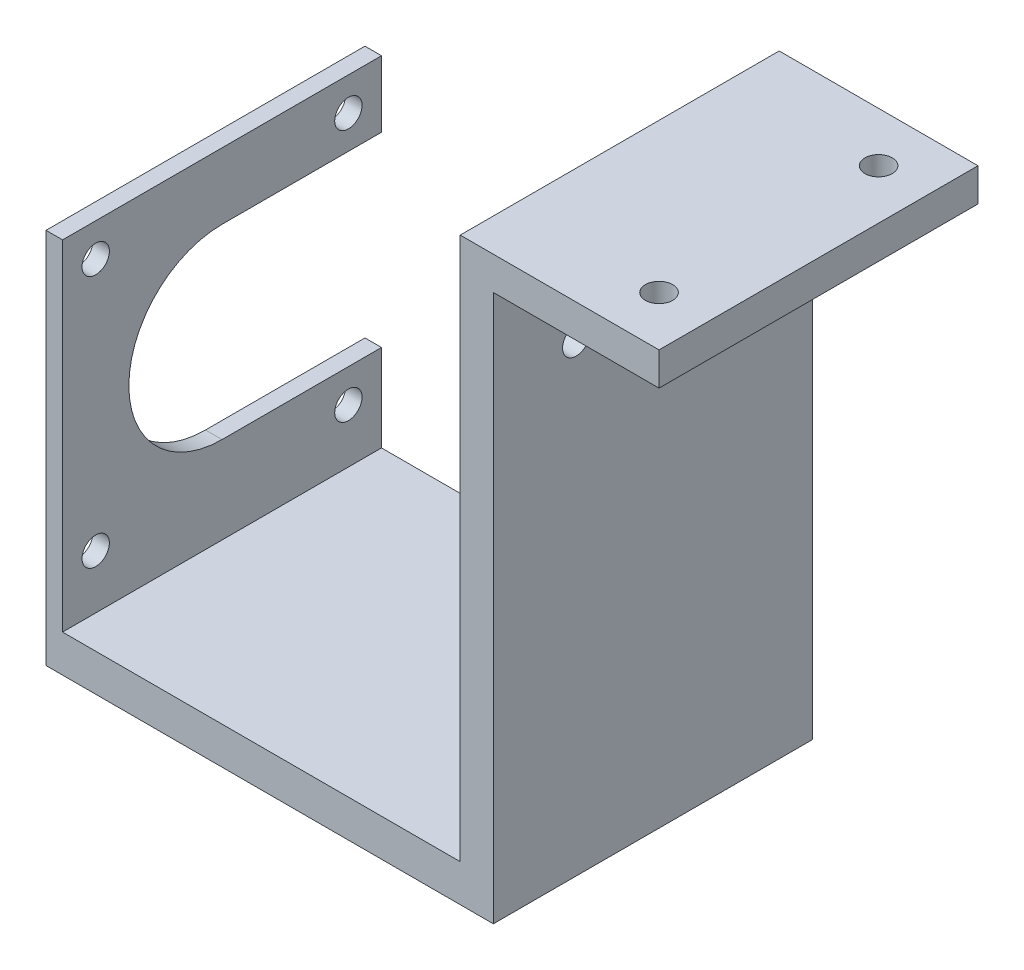
ISO-10303-21;
HEADER;
FILE_DESCRIPTION(('STEP AP214'),'2;1');
FILE_NAME('part.step','',(''),(''),'','','');
FILE_SCHEMA(('AUTOMOTIVE_DESIGN { 1 0 10303 214 1 1 1 1 }'));
ENDSEC;
DATA;
#1=APPLICATION_CONTEXT('core data for automotive mechanical design processes');
#2=APPLICATION_PROTOCOL_DEFINITION('international standard','automotive_design',2000,#1);
#3=PRODUCT_CONTEXT('',#1,'mechanical');
#4=PRODUCT('Part','Part','',(#3));
#5=PRODUCT_RELATED_PRODUCT_CATEGORY('part','',(#4));
#6=PRODUCT_DEFINITION_FORMATION('','',#4);
#7=PRODUCT_DEFINITION_CONTEXT('part definition',#1,'design');
#8=PRODUCT_DEFINITION('design','',#6,#7);
#9=PRODUCT_DEFINITION_SHAPE('','',#8);
#10=(LENGTH_UNIT() NAMED_UNIT(*) SI_UNIT(.MILLI.,.METRE.));
#11=(NAMED_UNIT(*) PLANE_ANGLE_UNIT() SI_UNIT($,.RADIAN.));
#12=(NAMED_UNIT(*) SI_UNIT($,.STERADIAN.) SOLID_ANGLE_UNIT());
#13=UNCERTAINTY_MEASURE_WITH_UNIT(LENGTH_MEASURE(1.E-05),#10,'distance_accuracy_value','');
#14=(GEOMETRIC_REPRESENTATION_CONTEXT(3) GLOBAL_UNCERTAINTY_ASSIGNED_CONTEXT((#13)) GLOBAL_UNIT_ASSIGNED_CONTEXT((#10,
#11,#12)) REPRESENTATION_CONTEXT('',''));
#15=CARTESIAN_POINT('',(0.,0.,0.));
#16=DIRECTION('',(0.,0.,1.));
#17=DIRECTION('',(1.,0.,0.));
#18=AXIS2_PLACEMENT_3D('',#15,#16,#17);
#19=CARTESIAN_POINT('',(24.,-16.,-25.75));
#20=DIRECTION('',(0.,0.,-1.));
#21=DIRECTION('',(-1.,0.,0.));
#22=AXIS2_PLACEMENT_3D('',#19,#20,#21);
#23=PLANE('',#22);
#24=DIRECTION('',(1.,0.,0.));
#25=VECTOR('',#24,1.);
#26=CARTESIAN_POINT('',(28.,-15.5,-25.75));
#27=LINE('',#26,#25);
#28=CARTESIAN_POINT('',(28.,-15.5,-25.75));
#29=VERTEX_POINT('',#28);
#30=CARTESIAN_POINT('',(76.,-15.5,-25.75));
#31=VERTEX_POINT('',#30);
#32=EDGE_CURVE('E172',#29,#31,#27,.T.);
#33=ORIENTED_EDGE('',*,*,#32,.T.);
#34=DIRECTION('',(0.,-1.,0.));
#35=VECTOR('',#34,1.);
#36=CARTESIAN_POINT('',(76.,49.5,-25.75));
#37=LINE('',#36,#35);
#38=CARTESIAN_POINT('',(76.,50.,-25.75));
#39=VERTEX_POINT('',#38);
#40=EDGE_CURVE('E197',#39,#31,#37,.T.);
#41=ORIENTED_EDGE('',*,*,#40,.F.);
#42=DIRECTION('',(1.,0.,0.));
#43=VECTOR('',#42,1.);
#44=CARTESIAN_POINT('',(76.,50.,-25.75));
#45=LINE('',#44,#43);
#46=CARTESIAN_POINT('',(100.,50.,-25.75));
#47=VERTEX_POINT('',#46);
#48=EDGE_CURVE('E220',#39,#47,#45,.T.);
#49=ORIENTED_EDGE('',*,*,#48,.T.);
#50=DIRECTION('',(0.,1.,0.));
#51=VECTOR('',#50,1.);
#52=CARTESIAN_POINT('',(100.,49.5,-25.75));
#53=LINE('',#52,#51);
#54=CARTESIAN_POINT('',(100.,46.0023371221997,-25.75));
#55=VERTEX_POINT('',#54);
#56=EDGE_CURVE('E211',#55,#47,#53,.T.);
#57=ORIENTED_EDGE('',*,*,#56,.F.);
#58=DIRECTION('',(1.,0.,0.));
#59=VECTOR('',#58,1.);
#60=CARTESIAN_POINT('',(80.,46.0023371221997,-25.75));
#61=LINE('',#60,#59);
#62=CARTESIAN_POINT('',(80.,46.0023371221997,-25.75));
#63=VERTEX_POINT('',#62);
#64=EDGE_CURVE('E230',#63,#55,#61,.T.);
#65=ORIENTED_EDGE('',*,*,#64,.F.);
#66=DIRECTION('',(0.,-1.,0.));
#67=VECTOR('',#66,1.);
#68=CARTESIAN_POINT('',(80.,49.5,-25.75));
#69=LINE('',#68,#67);
#70=CARTESIAN_POINT('',(80.,-20.,-25.75));
#71=VERTEX_POINT('',#70);
#72=EDGE_CURVE('E199',#63,#71,#69,.T.);
#73=ORIENTED_EDGE('',*,*,#72,.T.);
#74=DIRECTION('',(1.,0.,0.));
#75=VECTOR('',#74,1.);
#76=CARTESIAN_POINT('',(0.,-20.,-25.75));
#77=LINE('',#76,#75);
#78=CARTESIAN_POINT('',(26.,-20.,-25.75));
#79=VERTEX_POINT('',#78);
#80=EDGE_CURVE('E169',#79,#71,#77,.T.);
#81=ORIENTED_EDGE('',*,*,#80,.F.);
#82=DIRECTION('',(0.,-1.,0.));
#83=VECTOR('',#82,1.);
#84=CARTESIAN_POINT('',(26.,40.,-25.75));
#85=LINE('',#84,#83);
#86=CARTESIAN_POINT('',(26.,-5.,-25.75));
#87=VERTEX_POINT('',#86);
#88=EDGE_CURVE('E263',#87,#79,#85,.T.);
#89=ORIENTED_EDGE('',*,*,#88,.F.);
#90=DIRECTION('',(-1.,0.,0.));
#91=VECTOR('',#90,1.);
#92=CARTESIAN_POINT('',(28.,-5.,-25.75));
#93=LINE('',#92,#91);
#94=CARTESIAN_POINT('',(28.,-5.,-25.75));
#95=VERTEX_POINT('',#94);
#96=EDGE_CURVE('E143',#95,#87,#93,.T.);
#97=ORIENTED_EDGE('',*,*,#96,.F.);
#98=DIRECTION('',(0.,1.,0.));
#99=VECTOR('',#98,1.);
#100=CARTESIAN_POINT('',(28.,-16.,-25.75));
#101=LINE('',#100,#99);
#102=EDGE_CURVE('E11',#29,#95,#101,.T.);
#103=ORIENTED_EDGE('',*,*,#102,.F.);
#104=EDGE_LOOP('',(#33,#41,#49,#57,#65,#73,#81,#89,#97,#103));
#105=FACE_BOUND('',#104,.T.);
#106=ADVANCED_FACE('F35',(#105),#23,.T.);
#107=CARTESIAN_POINT('',(28.,22.5,-21.75));
#108=DIRECTION('',(-1.,0.,0.));
#109=DIRECTION('',(0.,0.,1.));
#110=AXIS2_PLACEMENT_3D('',#107,#108,#109);
#111=PLANE('',#110);
#112=CARTESIAN_POINT('',(28.,21.5,8.75));
#113=DIRECTION('',(1.,0.,0.));
#114=DIRECTION('',(0.,0.,-1.));
#115=AXIS2_PLACEMENT_3D('',#112,#113,#114);
#116=CIRCLE('',#115,1.65);
#117=CARTESIAN_POINT('',(28.,21.5,7.1));
#118=VERTEX_POINT('',#117);
#119=EDGE_CURVE('E181',#118,#118,#116,.T.);
#120=ORIENTED_EDGE('',*,*,#119,.F.);
#121=EDGE_LOOP('',(#120));
#122=FACE_BOUND('',#121,.T.);
#123=CARTESIAN_POINT('',(28.,21.5,-21.75));
#124=DIRECTION('',(1.,0.,0.));
#125=DIRECTION('',(0.,0.,-1.));
#126=AXIS2_PLACEMENT_3D('',#123,#124,#125);
#127=CIRCLE('',#126,1.65);
#128=CARTESIAN_POINT('',(28.,21.5,-23.4));
#129=VERTEX_POINT('',#128);
#130=EDGE_CURVE('E184',#129,#129,#127,.T.);
#131=ORIENTED_EDGE('',*,*,#130,.F.);
#132=EDGE_LOOP('',(#131));
#133=FACE_BOUND('',#132,.T.);
#134=CARTESIAN_POINT('',(28.,-9.,-21.75));
#135=DIRECTION('',(-1.,0.,0.));
#136=DIRECTION('',(0.,0.,1.));
#137=AXIS2_PLACEMENT_3D('',#134,#135,#136);
#138=CIRCLE('',#137,1.65);
#139=CARTESIAN_POINT('',(28.,-9.,-20.1));
#140=VERTEX_POINT('',#139);
#141=EDGE_CURVE('E187',#140,#140,#138,.T.);
#142=ORIENTED_EDGE('',*,*,#141,.T.);
#143=EDGE_LOOP('',(#142));
#144=FACE_BOUND('',#143,.T.);
#145=CARTESIAN_POINT('',(28.,-9.,8.75));
#146=DIRECTION('',(-1.,0.,0.));
#147=DIRECTION('',(0.,0.,1.));
#148=AXIS2_PLACEMENT_3D('',#145,#146,#147);
#149=CIRCLE('',#148,1.65);
#150=CARTESIAN_POINT('',(28.,-9.,10.4));
#151=VERTEX_POINT('',#150);
#152=EDGE_CURVE('E190',#151,#151,#149,.T.);
#153=ORIENTED_EDGE('',*,*,#152,.T.);
#154=EDGE_LOOP('',(#153));
#155=FACE_BOUND('',#154,.T.);
#156=DIRECTION('',(0.,0.,-1.));
#157=VECTOR('',#156,1.);
#158=CARTESIAN_POINT('',(28.,-5.,0.));
#159=LINE('',#158,#157);
#160=CARTESIAN_POINT('',(28.,-5.,-6.5));
#161=VERTEX_POINT('',#160);
#162=EDGE_CURVE('E154',#161,#95,#159,.T.);
#163=ORIENTED_EDGE('',*,*,#162,.F.);
#164=CARTESIAN_POINT('',(28.,6.25,-6.5));
#165=DIRECTION('',(-1.,0.,0.));
#166=DIRECTION('',(0.,0.,1.));
#167=AXIS2_PLACEMENT_3D('',#164,#165,#166);
#168=CIRCLE('',#167,11.25);
#169=CARTESIAN_POINT('',(28.,17.5,-6.5));
#170=VERTEX_POINT('',#169);
#171=EDGE_CURVE('E153',#161,#170,#168,.T.);
#172=ORIENTED_EDGE('',*,*,#171,.T.);
#173=DIRECTION('',(0.,0.,-1.));
#174=VECTOR('',#173,1.);
#175=CARTESIAN_POINT('',(28.,17.5,0.));
#176=LINE('',#175,#174);
#177=CARTESIAN_POINT('',(28.,17.5,-25.75));
#178=VERTEX_POINT('',#177);
#179=EDGE_CURVE('E59',#170,#178,#176,.T.);
#180=ORIENTED_EDGE('',*,*,#179,.T.);
#181=CARTESIAN_POINT('',(28.,25.5,-25.75));
#182=VERTEX_POINT('',#181);
#183=EDGE_CURVE('E44',#178,#182,#101,.T.);
#184=ORIENTED_EDGE('',*,*,#183,.T.);
#185=DIRECTION('',(0.,0.,-1.));
#186=VECTOR('',#185,1.);
#187=CARTESIAN_POINT('',(28.,25.5,-25.75));
#188=LINE('',#187,#186);
#189=CARTESIAN_POINT('',(28.,25.5,12.75));
#190=VERTEX_POINT('',#189);
#191=EDGE_CURVE('E167',#190,#182,#188,.T.);
#192=ORIENTED_EDGE('',*,*,#191,.F.);
#193=DIRECTION('',(0.,1.,0.));
#194=VECTOR('',#193,1.);
#195=CARTESIAN_POINT('',(28.,-16.,12.75));
#196=LINE('',#195,#194);
#197=CARTESIAN_POINT('',(28.,-15.5,12.75));
#198=VERTEX_POINT('',#197);
#199=EDGE_CURVE('E160',#198,#190,#196,.T.);
#200=ORIENTED_EDGE('',*,*,#199,.F.);
#201=DIRECTION('',(0.,0.,-1.));
#202=VECTOR('',#201,1.);
#203=CARTESIAN_POINT('',(28.,-15.5,12.75));
#204=LINE('',#203,#202);
#205=EDGE_CURVE('E177',#198,#29,#204,.T.);
#206=ORIENTED_EDGE('',*,*,#205,.T.);
#207=ORIENTED_EDGE('',*,*,#102,.T.);
#208=EDGE_LOOP('',(#163,#172,#180,#184,#192,#200,#206,#207));
#209=FACE_BOUND('',#208,.T.);
#210=ADVANCED_FACE('F149',(#122,#133,#144,#155,#209),#111,.F.);
#211=CARTESIAN_POINT('',(26.,40.,12.75));
#212=DIRECTION('',(1.,0.,0.));
#213=DIRECTION('',(0.,0.,-1.));
#214=AXIS2_PLACEMENT_3D('',#211,#212,#213);
#215=PLANE('',#214);
#216=CARTESIAN_POINT('',(26.,21.5,8.75));
#217=DIRECTION('',(1.,0.,0.));
#218=DIRECTION('',(0.,0.,-1.));
#219=AXIS2_PLACEMENT_3D('',#216,#217,#218);
#220=CIRCLE('',#219,1.65);
#221=CARTESIAN_POINT('',(26.,21.5,7.1));
#222=VERTEX_POINT('',#221);
#223=EDGE_CURVE('E251',#222,#222,#220,.F.);
#224=ORIENTED_EDGE('',*,*,#223,.F.);
#225=EDGE_LOOP('',(#224));
#226=FACE_BOUND('',#225,.T.);
#227=CARTESIAN_POINT('',(26.,-9.,-21.75));
#228=DIRECTION('',(1.,0.,0.));
#229=DIRECTION('',(0.,0.,-1.));
#230=AXIS2_PLACEMENT_3D('',#227,#228,#229);
#231=CIRCLE('',#230,1.65);
#232=CARTESIAN_POINT('',(26.,-9.,-23.4));
#233=VERTEX_POINT('',#232);
#234=EDGE_CURVE('E257',#233,#233,#231,.F.);
#235=ORIENTED_EDGE('',*,*,#234,.F.);
#236=EDGE_LOOP('',(#235));
#237=FACE_BOUND('',#236,.T.);
#238=CARTESIAN_POINT('',(26.,-9.,8.75));
#239=DIRECTION('',(1.,0.,0.));
#240=DIRECTION('',(0.,0.,-1.));
#241=AXIS2_PLACEMENT_3D('',#238,#239,#240);
#242=CIRCLE('',#241,1.65);
#243=CARTESIAN_POINT('',(26.,-9.,7.1));
#244=VERTEX_POINT('',#243);
#245=EDGE_CURVE('E39',#244,#244,#242,.F.);
#246=ORIENTED_EDGE('',*,*,#245,.F.);
#247=EDGE_LOOP('',(#246));
#248=FACE_BOUND('',#247,.T.);
#249=CARTESIAN_POINT('',(26.,21.5,-21.75));
#250=DIRECTION('',(1.,0.,0.));
#251=DIRECTION('',(0.,0.,-1.));
#252=AXIS2_PLACEMENT_3D('',#249,#250,#251);
#253=CIRCLE('',#252,1.65);
#254=CARTESIAN_POINT('',(26.,21.5,-23.4));
#255=VERTEX_POINT('',#254);
#256=EDGE_CURVE('E254',#255,#255,#253,.F.);
#257=ORIENTED_EDGE('',*,*,#256,.F.);
#258=EDGE_LOOP('',(#257));
#259=FACE_BOUND('',#258,.T.);
#260=DIRECTION('',(0.,0.,-1.));
#261=VECTOR('',#260,1.);
#262=CARTESIAN_POINT('',(26.,-5.,0.));
#263=LINE('',#262,#261);
#264=CARTESIAN_POINT('',(26.,-5.,-6.5));
#265=VERTEX_POINT('',#264);
#266=EDGE_CURVE('E51',#265,#87,#263,.T.);
#267=ORIENTED_EDGE('',*,*,#266,.T.);
#268=ORIENTED_EDGE('',*,*,#88,.T.);
#269=DIRECTION('',(0.,0.,1.));
#270=VECTOR('',#269,1.);
#271=CARTESIAN_POINT('',(26.,-20.,12.75));
#272=LINE('',#271,#270);
#273=CARTESIAN_POINT('',(26.,-20.,12.75));
#274=VERTEX_POINT('',#273);
#275=EDGE_CURVE('E266',#79,#274,#272,.T.);
#276=ORIENTED_EDGE('',*,*,#275,.T.);
#277=DIRECTION('',(0.,-1.,0.));
#278=VECTOR('',#277,1.);
#279=CARTESIAN_POINT('',(26.,40.,12.75));
#280=LINE('',#279,#278);
#281=CARTESIAN_POINT('',(26.,25.5,12.75));
#282=VERTEX_POINT('',#281);
#283=EDGE_CURVE('E262',#282,#274,#280,.T.);
#284=ORIENTED_EDGE('',*,*,#283,.F.);
#285=DIRECTION('',(0.,0.,1.));
#286=VECTOR('',#285,1.);
#287=CARTESIAN_POINT('',(26.,25.5,0.));
#288=LINE('',#287,#286);
#289=CARTESIAN_POINT('',(26.,25.5,-25.75));
#290=VERTEX_POINT('',#289);
#291=EDGE_CURVE('E248',#290,#282,#288,.T.);
#292=ORIENTED_EDGE('',*,*,#291,.F.);
#293=CARTESIAN_POINT('',(26.,17.5,-25.75));
#294=VERTEX_POINT('',#293);
#295=EDGE_CURVE('E260',#290,#294,#85,.T.);
#296=ORIENTED_EDGE('',*,*,#295,.T.);
#297=DIRECTION('',(0.,0.,-1.));
#298=VECTOR('',#297,1.);
#299=CARTESIAN_POINT('',(26.,17.5,0.));
#300=LINE('',#299,#298);
#301=CARTESIAN_POINT('',(26.,17.5,-6.5));
#302=VERTEX_POINT('',#301);
#303=EDGE_CURVE('E138',#302,#294,#300,.T.);
#304=ORIENTED_EDGE('',*,*,#303,.F.);
#305=CARTESIAN_POINT('',(26.,6.25,-6.5));
#306=DIRECTION('',(-1.,0.,0.));
#307=DIRECTION('',(0.,0.,1.));
#308=AXIS2_PLACEMENT_3D('',#305,#306,#307);
#309=CIRCLE('',#308,11.25);
#310=EDGE_CURVE('E268',#265,#302,#309,.T.);
#311=ORIENTED_EDGE('',*,*,#310,.F.);
#312=EDGE_LOOP('',(#267,#268,#276,#284,#292,#296,#304,#311));
#313=FACE_BOUND('',#312,.T.);
#314=ADVANCED_FACE('F323',(#226,#237,#248,#259,#313),#215,.F.);
#315=CARTESIAN_POINT('',(28.,6.25,-6.5));
#316=DIRECTION('',(-1.,0.,0.));
#317=DIRECTION('',(0.,0.,1.));
#318=AXIS2_PLACEMENT_3D('',#315,#316,#317);
#319=CYLINDRICAL_SURFACE('',#318,11.25);
#320=DIRECTION('',(-1.,0.,0.));
#321=VECTOR('',#320,1.);
#322=CARTESIAN_POINT('',(28.,-5.,-6.5));
#323=LINE('',#322,#321);
#324=EDGE_CURVE('E271',#161,#265,#323,.T.);
#325=ORIENTED_EDGE('',*,*,#324,.T.);
#326=ORIENTED_EDGE('',*,*,#310,.T.);
#327=DIRECTION('',(-1.,0.,0.));
#328=VECTOR('',#327,1.);
#329=CARTESIAN_POINT('',(28.,17.5,-6.5));
#330=LINE('',#329,#328);
#331=EDGE_CURVE('E144',#170,#302,#330,.T.);
#332=ORIENTED_EDGE('',*,*,#331,.F.);
#333=ORIENTED_EDGE('',*,*,#171,.F.);
#334=EDGE_LOOP('',(#325,#326,#332,#333));
#335=FACE_BOUND('',#334,.T.);
#336=ADVANCED_FACE('F365',(#335),#319,.F.);
#337=CARTESIAN_POINT('',(80.,49.5,12.75));
#338=DIRECTION('',(1.,0.,0.));
#339=DIRECTION('',(0.,0.,-1.));
#340=AXIS2_PLACEMENT_3D('',#337,#338,#339);
#341=PLANE('',#340);
#342=CARTESIAN_POINT('',(80.,36.,-15.75));
#343=DIRECTION('',(1.,0.,0.));
#344=DIRECTION('',(0.,0.,-1.));
#345=AXIS2_PLACEMENT_3D('',#342,#343,#344);
#346=CIRCLE('',#345,1.65);
#347=CARTESIAN_POINT('',(80.,36.,-17.4));
#348=VERTEX_POINT('',#347);
#349=EDGE_CURVE('E285',#348,#348,#346,.T.);
#350=ORIENTED_EDGE('',*,*,#349,.F.);
#351=EDGE_LOOP('',(#350));
#352=FACE_BOUND('',#351,.T.);
#353=CARTESIAN_POINT('',(80.,36.,2.74999999999999));
#354=DIRECTION('',(1.,0.,0.));
#355=DIRECTION('',(0.,0.,-1.));
#356=AXIS2_PLACEMENT_3D('',#353,#354,#355);
#357=CIRCLE('',#356,1.65);
#358=CARTESIAN_POINT('',(80.,36.,1.09999999999999));
#359=VERTEX_POINT('',#358);
#360=EDGE_CURVE('E278',#359,#359,#357,.T.);
#361=ORIENTED_EDGE('',*,*,#360,.F.);
#362=EDGE_LOOP('',(#361));
#363=FACE_BOUND('',#362,.T.);
#364=ORIENTED_EDGE('',*,*,#72,.F.);
#365=DIRECTION('',(0.,0.,-1.));
#366=VECTOR('',#365,1.);
#367=CARTESIAN_POINT('',(80.,46.0023371221997,-25.75));
#368=LINE('',#367,#366);
#369=CARTESIAN_POINT('',(80.,46.0023371221997,12.75));
#370=VERTEX_POINT('',#369);
#371=EDGE_CURVE('E233',#370,#63,#368,.T.);
#372=ORIENTED_EDGE('',*,*,#371,.F.);
#373=DIRECTION('',(0.,-1.,0.));
#374=VECTOR('',#373,1.);
#375=CARTESIAN_POINT('',(80.,49.5,12.75));
#376=LINE('',#375,#374);
#377=CARTESIAN_POINT('',(80.,-20.,12.75));
#378=VERTEX_POINT('',#377);
#379=EDGE_CURVE('E203',#370,#378,#376,.T.);
#380=ORIENTED_EDGE('',*,*,#379,.T.);
#381=DIRECTION('',(0.,0.,1.));
#382=VECTOR('',#381,1.);
#383=CARTESIAN_POINT('',(80.,-20.,12.75));
#384=LINE('',#383,#382);
#385=EDGE_CURVE('E200',#71,#378,#384,.T.);
#386=ORIENTED_EDGE('',*,*,#385,.F.);
#387=EDGE_LOOP('',(#364,#372,#380,#386));
#388=FACE_BOUND('',#387,.T.);
#389=ADVANCED_FACE('F298',(#352,#363,#388),#341,.T.);
#390=CARTESIAN_POINT('',(76.,49.5,12.75));
#391=DIRECTION('',(-1.,0.,0.));
#392=DIRECTION('',(0.,0.,1.));
#393=AXIS2_PLACEMENT_3D('',#390,#391,#392);
#394=PLANE('',#393);
#395=DIRECTION('',(0.,0.,1.));
#396=VECTOR('',#395,1.);
#397=CARTESIAN_POINT('',(76.,-15.5,12.75));
#398=LINE('',#397,#396);
#399=CARTESIAN_POINT('',(76.,-15.5,12.75));
#400=VERTEX_POINT('',#399);
#401=EDGE_CURVE('E193',#31,#400,#398,.T.);
#402=ORIENTED_EDGE('',*,*,#401,.T.);
#403=DIRECTION('',(0.,-1.,0.));
#404=VECTOR('',#403,1.);
#405=CARTESIAN_POINT('',(76.,49.5,12.75));
#406=LINE('',#405,#404);
#407=CARTESIAN_POINT('',(76.,50.,12.75));
#408=VERTEX_POINT('',#407);
#409=EDGE_CURVE('E196',#408,#400,#406,.T.);
#410=ORIENTED_EDGE('',*,*,#409,.F.);
#411=DIRECTION('',(0.,0.,-1.));
#412=VECTOR('',#411,1.);
#413=CARTESIAN_POINT('',(76.,50.,12.75));
#414=LINE('',#413,#412);
#415=EDGE_CURVE('E214',#408,#39,#414,.T.);
#416=ORIENTED_EDGE('',*,*,#415,.T.);
#417=ORIENTED_EDGE('',*,*,#40,.T.);
#418=EDGE_LOOP('',(#402,#410,#416,#417));
#419=FACE_BOUND('',#418,.T.);
#420=CARTESIAN_POINT('',(76.,36.,-15.75));
#421=DIRECTION('',(-1.,0.,0.));
#422=DIRECTION('',(0.,0.,1.));
#423=AXIS2_PLACEMENT_3D('',#420,#421,#422);
#424=CIRCLE('',#423,1.65);
#425=CARTESIAN_POINT('',(76.,36.,-14.1));
#426=VERTEX_POINT('',#425);
#427=EDGE_CURVE('E288',#426,#426,#424,.T.);
#428=ORIENTED_EDGE('',*,*,#427,.F.);
#429=EDGE_LOOP('',(#428));
#430=FACE_BOUND('',#429,.T.);
#431=CARTESIAN_POINT('',(76.,36.,2.74999999999999));
#432=DIRECTION('',(-1.,0.,0.));
#433=DIRECTION('',(0.,0.,1.));
#434=AXIS2_PLACEMENT_3D('',#431,#432,#433);
#435=CIRCLE('',#434,1.65);
#436=CARTESIAN_POINT('',(76.,36.,4.39999999999999));
#437=VERTEX_POINT('',#436);
#438=EDGE_CURVE('E282',#437,#437,#435,.T.);
#439=ORIENTED_EDGE('',*,*,#438,.F.);
#440=EDGE_LOOP('',(#439));
#441=FACE_BOUND('',#440,.T.);
#442=ADVANCED_FACE('F294',(#419,#430,#441),#394,.T.);
#443=CARTESIAN_POINT('',(24.,-16.,12.75));
#444=DIRECTION('',(0.,0.,1.));
#445=DIRECTION('',(1.,0.,0.));
#446=AXIS2_PLACEMENT_3D('',#443,#444,#445);
#447=PLANE('',#446);
#448=ORIENTED_EDGE('',*,*,#409,.T.);
#449=DIRECTION('',(1.,0.,0.));
#450=VECTOR('',#449,1.);
#451=CARTESIAN_POINT('',(28.,-15.5,12.75));
#452=LINE('',#451,#450);
#453=EDGE_CURVE('E174',#198,#400,#452,.T.);
#454=ORIENTED_EDGE('',*,*,#453,.F.);
#455=ORIENTED_EDGE('',*,*,#199,.T.);
#456=DIRECTION('',(1.,0.,0.));
#457=VECTOR('',#456,1.);
#458=CARTESIAN_POINT('',(28.,25.5,12.75));
#459=LINE('',#458,#457);
#460=EDGE_CURVE('E162',#282,#190,#459,.T.);
#461=ORIENTED_EDGE('',*,*,#460,.F.);
#462=ORIENTED_EDGE('',*,*,#283,.T.);
#463=DIRECTION('',(1.,0.,0.));
#464=VECTOR('',#463,1.);
#465=CARTESIAN_POINT('',(0.,-20.,12.75));
#466=LINE('',#465,#464);
#467=EDGE_CURVE('E170',#274,#378,#466,.T.);
#468=ORIENTED_EDGE('',*,*,#467,.T.);
#469=ORIENTED_EDGE('',*,*,#379,.F.);
#470=DIRECTION('',(-1.,0.,0.));
#471=VECTOR('',#470,1.);
#472=CARTESIAN_POINT('',(80.,46.0023371221997,12.75));
#473=LINE('',#472,#471);
#474=CARTESIAN_POINT('',(100.,46.0023371221997,12.75));
#475=VERTEX_POINT('',#474);
#476=EDGE_CURVE('E223',#475,#370,#473,.T.);
#477=ORIENTED_EDGE('',*,*,#476,.F.);
#478=DIRECTION('',(0.,-1.,0.));
#479=VECTOR('',#478,1.);
#480=CARTESIAN_POINT('',(100.,49.5,12.75));
#481=LINE('',#480,#479);
#482=CARTESIAN_POINT('',(100.,50.,12.75));
#483=VERTEX_POINT('',#482);
#484=EDGE_CURVE('E209',#483,#475,#481,.T.);
#485=ORIENTED_EDGE('',*,*,#484,.F.);
#486=DIRECTION('',(1.,0.,0.));
#487=VECTOR('',#486,1.);
#488=CARTESIAN_POINT('',(76.,50.,12.75));
#489=LINE('',#488,#487);
#490=EDGE_CURVE('E217',#408,#483,#489,.T.);
#491=ORIENTED_EDGE('',*,*,#490,.F.);
#492=EDGE_LOOP('',(#448,#454,#455,#461,#462,#468,#469,#477,#485,#491));
#493=FACE_BOUND('',#492,.T.);
#494=ADVANCED_FACE('F297',(#493),#447,.T.);
#495=DIRECTION('',(-1.,0.,0.));
#496=VECTOR('',#495,1.);
#497=CARTESIAN_POINT('',(28.,17.5,-25.75));
#498=LINE('',#497,#496);
#499=EDGE_CURVE('E135',#178,#294,#498,.T.);
#500=ORIENTED_EDGE('',*,*,#499,.T.);
#501=ORIENTED_EDGE('',*,*,#295,.F.);
#502=DIRECTION('',(-1.,0.,0.));
#503=VECTOR('',#502,1.);
#504=CARTESIAN_POINT('',(28.,25.5,-25.75));
#505=LINE('',#504,#503);
#506=EDGE_CURVE('E159',#182,#290,#505,.T.);
#507=ORIENTED_EDGE('',*,*,#506,.F.);
#508=ORIENTED_EDGE('',*,*,#183,.F.);
#509=EDGE_LOOP('',(#500,#501,#507,#508));
#510=FACE_BOUND('',#509,.T.);
#511=ADVANCED_FACE('F157',(#510),#23,.T.);
#512=CARTESIAN_POINT('',(0.,-20.,0.));
#513=DIRECTION('',(0.,1.,0.));
#514=DIRECTION('',(0.,0.,1.));
#515=AXIS2_PLACEMENT_3D('',#512,#513,#514);
#516=PLANE('',#515);
#517=ORIENTED_EDGE('',*,*,#467,.F.);
#518=ORIENTED_EDGE('',*,*,#275,.F.);
#519=ORIENTED_EDGE('',*,*,#80,.T.);
#520=ORIENTED_EDGE('',*,*,#385,.T.);
#521=EDGE_LOOP('',(#517,#518,#519,#520));
#522=FACE_BOUND('',#521,.T.);
#523=ADVANCED_FACE('F37',(#522),#516,.F.);
#524=CARTESIAN_POINT('',(0.,25.5,0.));
#525=DIRECTION('',(0.,-1.,0.));
#526=DIRECTION('',(0.,0.,-1.));
#527=AXIS2_PLACEMENT_3D('',#524,#525,#526);
#528=PLANE('',#527);
#529=ORIENTED_EDGE('',*,*,#506,.T.);
#530=ORIENTED_EDGE('',*,*,#291,.T.);
#531=ORIENTED_EDGE('',*,*,#460,.T.);
#532=ORIENTED_EDGE('',*,*,#191,.T.);
#533=EDGE_LOOP('',(#529,#530,#531,#532));
#534=FACE_BOUND('',#533,.T.);
#535=ADVANCED_FACE('F332',(#534),#528,.F.);
#536=CARTESIAN_POINT('',(28.,-15.5,12.75));
#537=DIRECTION('',(0.,-1.,0.));
#538=DIRECTION('',(0.,0.,-1.));
#539=AXIS2_PLACEMENT_3D('',#536,#537,#538);
#540=PLANE('',#539);
#541=ORIENTED_EDGE('',*,*,#453,.T.);
#542=ORIENTED_EDGE('',*,*,#401,.F.);
#543=ORIENTED_EDGE('',*,*,#32,.F.);
#544=ORIENTED_EDGE('',*,*,#205,.F.);
#545=EDGE_LOOP('',(#541,#542,#543,#544));
#546=FACE_BOUND('',#545,.T.);
#547=ADVANCED_FACE('F341',(#546),#540,.F.);
#548=CARTESIAN_POINT('',(20.,21.5,8.75));
#549=DIRECTION('',(1.,0.,0.));
#550=DIRECTION('',(0.,0.,-1.));
#551=AXIS2_PLACEMENT_3D('',#548,#549,#550);
#552=CYLINDRICAL_SURFACE('',#551,1.65);
#553=ORIENTED_EDGE('',*,*,#223,.T.);
#554=EDGE_LOOP('',(#553));
#555=FACE_BOUND('',#554,.T.);
#556=ORIENTED_EDGE('',*,*,#119,.T.);
#557=EDGE_LOOP('',(#556));
#558=FACE_BOUND('',#557,.T.);
#559=ADVANCED_FACE('F345',(#555,#558),#552,.F.);
#560=CARTESIAN_POINT('',(20.,21.5,-21.75));
#561=DIRECTION('',(1.,0.,0.));
#562=DIRECTION('',(0.,0.,-1.));
#563=AXIS2_PLACEMENT_3D('',#560,#561,#562);
#564=CYLINDRICAL_SURFACE('',#563,1.65);
#565=ORIENTED_EDGE('',*,*,#256,.T.);
#566=EDGE_LOOP('',(#565));
#567=FACE_BOUND('',#566,.T.);
#568=ORIENTED_EDGE('',*,*,#130,.T.);
#569=EDGE_LOOP('',(#568));
#570=FACE_BOUND('',#569,.T.);
#571=ADVANCED_FACE('F349',(#567,#570),#564,.F.);
#572=CARTESIAN_POINT('',(28.,-9.,-21.75));
#573=DIRECTION('',(-1.,0.,0.));
#574=DIRECTION('',(0.,0.,1.));
#575=AXIS2_PLACEMENT_3D('',#572,#573,#574);
#576=CYLINDRICAL_SURFACE('',#575,1.65);
#577=ORIENTED_EDGE('',*,*,#234,.T.);
#578=EDGE_LOOP('',(#577));
#579=FACE_BOUND('',#578,.T.);
#580=ORIENTED_EDGE('',*,*,#141,.F.);
#581=EDGE_LOOP('',(#580));
#582=FACE_BOUND('',#581,.T.);
#583=ADVANCED_FACE('F353',(#579,#582),#576,.F.);
#584=CARTESIAN_POINT('',(28.,-9.,8.75));
#585=DIRECTION('',(-1.,0.,0.));
#586=DIRECTION('',(0.,0.,1.));
#587=AXIS2_PLACEMENT_3D('',#584,#585,#586);
#588=CYLINDRICAL_SURFACE('',#587,1.65);
#589=ORIENTED_EDGE('',*,*,#245,.T.);
#590=EDGE_LOOP('',(#589));
#591=FACE_BOUND('',#590,.T.);
#592=ORIENTED_EDGE('',*,*,#152,.F.);
#593=EDGE_LOOP('',(#592));
#594=FACE_BOUND('',#593,.T.);
#595=ADVANCED_FACE('F357',(#591,#594),#588,.F.);
#596=CARTESIAN_POINT('',(100.,0.,0.));
#597=DIRECTION('',(-1.,0.,0.));
#598=DIRECTION('',(0.,0.,1.));
#599=AXIS2_PLACEMENT_3D('',#596,#597,#598);
#600=PLANE('',#599);
#601=ORIENTED_EDGE('',*,*,#56,.T.);
#602=DIRECTION('',(0.,0.,-1.));
#603=VECTOR('',#602,1.);
#604=CARTESIAN_POINT('',(100.,50.,12.75));
#605=LINE('',#604,#603);
#606=EDGE_CURVE('E213',#483,#47,#605,.T.);
#607=ORIENTED_EDGE('',*,*,#606,.F.);
#608=ORIENTED_EDGE('',*,*,#484,.T.);
#609=DIRECTION('',(0.,0.,1.));
#610=VECTOR('',#609,1.);
#611=CARTESIAN_POINT('',(100.,46.0023371221997,-25.75));
#612=LINE('',#611,#610);
#613=EDGE_CURVE('E227',#55,#475,#612,.T.);
#614=ORIENTED_EDGE('',*,*,#613,.F.);
#615=EDGE_LOOP('',(#601,#607,#608,#614));
#616=FACE_BOUND('',#615,.T.);
#617=ADVANCED_FACE('F360',(#616),#600,.F.);
#618=CARTESIAN_POINT('',(76.,50.,12.75));
#619=DIRECTION('',(0.,1.,0.));
#620=DIRECTION('',(-1.,0.,0.));
#621=AXIS2_PLACEMENT_3D('',#618,#619,#620);
#622=PLANE('',#621);
#623=CARTESIAN_POINT('',(94.,50.,-19.75));
#624=DIRECTION('',(0.,1.,0.));
#625=DIRECTION('',(-1.,0.,0.));
#626=AXIS2_PLACEMENT_3D('',#623,#624,#625);
#627=CIRCLE('',#626,1.65);
#628=CARTESIAN_POINT('',(92.35,50.,-19.75));
#629=VERTEX_POINT('',#628);
#630=EDGE_CURVE('E242',#629,#629,#627,.T.);
#631=ORIENTED_EDGE('',*,*,#630,.F.);
#632=EDGE_LOOP('',(#631));
#633=FACE_BOUND('',#632,.T.);
#634=CARTESIAN_POINT('',(94.,50.,6.75));
#635=DIRECTION('',(0.,1.,0.));
#636=DIRECTION('',(-1.,0.,0.));
#637=AXIS2_PLACEMENT_3D('',#634,#635,#636);
#638=CIRCLE('',#637,1.65);
#639=CARTESIAN_POINT('',(92.35,50.,6.75));
#640=VERTEX_POINT('',#639);
#641=EDGE_CURVE('E236',#640,#640,#638,.T.);
#642=ORIENTED_EDGE('',*,*,#641,.F.);
#643=EDGE_LOOP('',(#642));
#644=FACE_BOUND('',#643,.T.);
#645=ORIENTED_EDGE('',*,*,#48,.F.);
#646=ORIENTED_EDGE('',*,*,#415,.F.);
#647=ORIENTED_EDGE('',*,*,#490,.T.);
#648=ORIENTED_EDGE('',*,*,#606,.T.);
#649=EDGE_LOOP('',(#645,#646,#647,#648));
#650=FACE_BOUND('',#649,.T.);
#651=ADVANCED_FACE('F369',(#633,#644,#650),#622,.T.);
#652=CARTESIAN_POINT('',(0.,46.0023371221997,0.));
#653=DIRECTION('',(0.,1.,0.));
#654=DIRECTION('',(0.,0.,1.));
#655=AXIS2_PLACEMENT_3D('',#652,#653,#654);
#656=PLANE('',#655);
#657=CARTESIAN_POINT('',(94.,46.0023371221997,-19.75));
#658=DIRECTION('',(0.,-1.,0.));
#659=DIRECTION('',(0.,0.,-1.));
#660=AXIS2_PLACEMENT_3D('',#657,#658,#659);
#661=CIRCLE('',#660,1.65);
#662=CARTESIAN_POINT('',(94.,46.0023371221997,-21.4));
#663=VERTEX_POINT('',#662);
#664=EDGE_CURVE('E245',#663,#663,#661,.T.);
#665=ORIENTED_EDGE('',*,*,#664,.F.);
#666=EDGE_LOOP('',(#665));
#667=FACE_BOUND('',#666,.T.);
#668=CARTESIAN_POINT('',(94.,46.0023371221997,6.75));
#669=DIRECTION('',(0.,-1.,0.));
#670=DIRECTION('',(0.,0.,-1.));
#671=AXIS2_PLACEMENT_3D('',#668,#669,#670);
#672=CIRCLE('',#671,1.65);
#673=CARTESIAN_POINT('',(94.,46.0023371221997,5.09999999999999));
#674=VERTEX_POINT('',#673);
#675=EDGE_CURVE('E239',#674,#674,#672,.T.);
#676=ORIENTED_EDGE('',*,*,#675,.F.);
#677=EDGE_LOOP('',(#676));
#678=FACE_BOUND('',#677,.T.);
#679=ORIENTED_EDGE('',*,*,#371,.T.);
#680=ORIENTED_EDGE('',*,*,#64,.T.);
#681=ORIENTED_EDGE('',*,*,#613,.T.);
#682=ORIENTED_EDGE('',*,*,#476,.T.);
#683=EDGE_LOOP('',(#679,#680,#681,#682));
#684=FACE_BOUND('',#683,.T.);
#685=ADVANCED_FACE('F373',(#667,#678,#684),#656,.F.);
#686=CARTESIAN_POINT('',(94.,56.0023371221997,6.75));
#687=DIRECTION('',(0.,-1.,0.));
#688=DIRECTION('',(0.,0.,-1.));
#689=AXIS2_PLACEMENT_3D('',#686,#687,#688);
#690=CYLINDRICAL_SURFACE('',#689,1.65);
#691=ORIENTED_EDGE('',*,*,#641,.T.);
#692=EDGE_LOOP('',(#691));
#693=FACE_BOUND('',#692,.T.);
#694=ORIENTED_EDGE('',*,*,#675,.T.);
#695=EDGE_LOOP('',(#694));
#696=FACE_BOUND('',#695,.T.);
#697=ADVANCED_FACE('F377',(#693,#696),#690,.F.);
#698=CARTESIAN_POINT('',(94.,56.0023371221997,-19.75));
#699=DIRECTION('',(0.,-1.,0.));
#700=DIRECTION('',(0.,0.,-1.));
#701=AXIS2_PLACEMENT_3D('',#698,#699,#700);
#702=CYLINDRICAL_SURFACE('',#701,1.65);
#703=ORIENTED_EDGE('',*,*,#630,.T.);
#704=EDGE_LOOP('',(#703));
#705=FACE_BOUND('',#704,.T.);
#706=ORIENTED_EDGE('',*,*,#664,.T.);
#707=EDGE_LOOP('',(#706));
#708=FACE_BOUND('',#707,.T.);
#709=ADVANCED_FACE('F381',(#705,#708),#702,.F.);
#710=CARTESIAN_POINT('',(28.,17.5,0.));
#711=DIRECTION('',(0.,1.,0.));
#712=DIRECTION('',(0.,0.,1.));
#713=AXIS2_PLACEMENT_3D('',#710,#711,#712);
#714=PLANE('',#713);
#715=ORIENTED_EDGE('',*,*,#303,.T.);
#716=ORIENTED_EDGE('',*,*,#499,.F.);
#717=ORIENTED_EDGE('',*,*,#179,.F.);
#718=ORIENTED_EDGE('',*,*,#331,.T.);
#719=EDGE_LOOP('',(#715,#716,#717,#718));
#720=FACE_BOUND('',#719,.T.);
#721=ADVANCED_FACE('F136',(#720),#714,.F.);
#722=CARTESIAN_POINT('',(28.,-5.,0.));
#723=DIRECTION('',(0.,1.,0.));
#724=DIRECTION('',(0.,0.,1.));
#725=AXIS2_PLACEMENT_3D('',#722,#723,#724);
#726=PLANE('',#725);
#727=ORIENTED_EDGE('',*,*,#266,.F.);
#728=ORIENTED_EDGE('',*,*,#324,.F.);
#729=ORIENTED_EDGE('',*,*,#162,.T.);
#730=ORIENTED_EDGE('',*,*,#96,.T.);
#731=EDGE_LOOP('',(#727,#728,#729,#730));
#732=FACE_BOUND('',#731,.T.);
#733=ADVANCED_FACE('F305',(#732),#726,.T.);
#734=CARTESIAN_POINT('',(81.,36.,2.74999999999999));
#735=DIRECTION('',(-1.,0.,0.));
#736=DIRECTION('',(0.,0.,1.));
#737=AXIS2_PLACEMENT_3D('',#734,#735,#736);
#738=CYLINDRICAL_SURFACE('',#737,1.65);
#739=ORIENTED_EDGE('',*,*,#360,.T.);
#740=EDGE_LOOP('',(#739));
#741=FACE_BOUND('',#740,.T.);
#742=ORIENTED_EDGE('',*,*,#438,.T.);
#743=EDGE_LOOP('',(#742));
#744=FACE_BOUND('',#743,.T.);
#745=ADVANCED_FACE('F303',(#741,#744),#738,.F.);
#746=CARTESIAN_POINT('',(81.,36.,-15.75));
#747=DIRECTION('',(-1.,0.,0.));
#748=DIRECTION('',(0.,0.,1.));
#749=AXIS2_PLACEMENT_3D('',#746,#747,#748);
#750=CYLINDRICAL_SURFACE('',#749,1.65);
#751=ORIENTED_EDGE('',*,*,#349,.T.);
#752=EDGE_LOOP('',(#751));
#753=FACE_BOUND('',#752,.T.);
#754=ORIENTED_EDGE('',*,*,#427,.T.);
#755=EDGE_LOOP('',(#754));
#756=FACE_BOUND('',#755,.T.);
#757=ADVANCED_FACE('F292',(#753,#756),#750,.F.);
#758=CLOSED_SHELL('',(#106,#210,#314,#336,#389,#442,#494,#511,#523,#535,#547,#559,#571,#583,
#595,#617,#651,#685,#697,#709,#721,#733,#745,#757));
#759=MANIFOLD_SOLID_BREP('B2',#758);
#760=ADVANCED_BREP_SHAPE_REPRESENTATION('',(#18,#759),#14);
#761=SHAPE_DEFINITION_REPRESENTATION(#9,#760);
ENDSEC;
END-ISO-10303-21;
